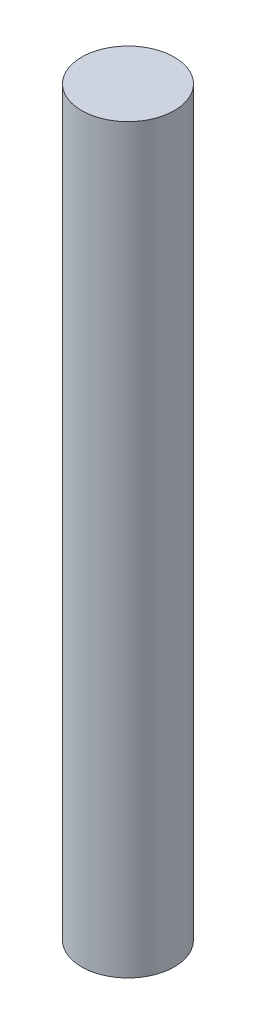
ISO-10303-21;
HEADER;
FILE_DESCRIPTION(('STEP AP214'),'2;1');
FILE_NAME('part.step','',(''),(''),'','','');
FILE_SCHEMA(('AUTOMOTIVE_DESIGN { 1 0 10303 214 1 1 1 1 }'));
ENDSEC;
DATA;
#1=APPLICATION_CONTEXT('core data for automotive mechanical design processes');
#2=APPLICATION_PROTOCOL_DEFINITION('international standard','automotive_design',2000,#1);
#3=PRODUCT_CONTEXT('',#1,'mechanical');
#4=PRODUCT('Part','Part','',(#3));
#5=PRODUCT_RELATED_PRODUCT_CATEGORY('part','',(#4));
#6=PRODUCT_DEFINITION_FORMATION('','',#4);
#7=PRODUCT_DEFINITION_CONTEXT('part definition',#1,'design');
#8=PRODUCT_DEFINITION('design','',#6,#7);
#9=PRODUCT_DEFINITION_SHAPE('','',#8);
#10=(LENGTH_UNIT() NAMED_UNIT(*) SI_UNIT(.MILLI.,.METRE.));
#11=(NAMED_UNIT(*) PLANE_ANGLE_UNIT() SI_UNIT($,.RADIAN.));
#12=(NAMED_UNIT(*) SI_UNIT($,.STERADIAN.) SOLID_ANGLE_UNIT());
#13=UNCERTAINTY_MEASURE_WITH_UNIT(LENGTH_MEASURE(1.E-05),#10,'distance_accuracy_value','');
#14=(GEOMETRIC_REPRESENTATION_CONTEXT(3) GLOBAL_UNCERTAINTY_ASSIGNED_CONTEXT((#13)) GLOBAL_UNIT_ASSIGNED_CONTEXT((#10,
#11,#12)) REPRESENTATION_CONTEXT('',''));
#15=CARTESIAN_POINT('',(0.,0.,0.));
#16=DIRECTION('',(0.,0.,1.));
#17=DIRECTION('',(1.,0.,0.));
#18=AXIS2_PLACEMENT_3D('',#15,#16,#17);
#19=CARTESIAN_POINT('',(0.,40.,0.));
#20=DIRECTION('',(0.,-1.,0.));
#21=DIRECTION('',(0.,0.,-1.));
#22=AXIS2_PLACEMENT_3D('',#19,#20,#21);
#23=CYLINDRICAL_SURFACE('',#22,2.5);
#24=CARTESIAN_POINT('',(0.,40.,0.));
#25=DIRECTION('',(0.,1.,0.));
#26=DIRECTION('',(0.,0.,1.));
#27=AXIS2_PLACEMENT_3D('',#24,#25,#26);
#28=CIRCLE('',#27,2.5);
#29=CARTESIAN_POINT('',(0.,40.,2.5));
#30=VERTEX_POINT('',#29);
#31=EDGE_CURVE('E10',#30,#30,#28,.T.);
#32=ORIENTED_EDGE('',*,*,#31,.F.);
#33=EDGE_LOOP('',(#32));
#34=FACE_BOUND('',#33,.T.);
#35=CARTESIAN_POINT('',(0.,0.,0.));
#36=DIRECTION('',(0.,1.,0.));
#37=DIRECTION('',(0.,0.,1.));
#38=AXIS2_PLACEMENT_3D('',#35,#36,#37);
#39=CIRCLE('',#38,2.5);
#40=CARTESIAN_POINT('',(0.,0.,2.5));
#41=VERTEX_POINT('',#40);
#42=EDGE_CURVE('E34',#41,#41,#39,.T.);
#43=ORIENTED_EDGE('',*,*,#42,.T.);
#44=EDGE_LOOP('',(#43));
#45=FACE_BOUND('',#44,.T.);
#46=ADVANCED_FACE('F31',(#34,#45),#23,.T.);
#47=CARTESIAN_POINT('',(0.,40.,0.));
#48=DIRECTION('',(0.,1.,0.));
#49=DIRECTION('',(0.,0.,1.));
#50=AXIS2_PLACEMENT_3D('',#47,#48,#49);
#51=PLANE('',#50);
#52=ORIENTED_EDGE('',*,*,#31,.T.);
#53=EDGE_LOOP('',(#52));
#54=FACE_BOUND('',#53,.T.);
#55=ADVANCED_FACE('F46',(#54),#51,.T.);
#56=CARTESIAN_POINT('',(0.,0.,0.));
#57=DIRECTION('',(0.,1.,0.));
#58=DIRECTION('',(0.,0.,1.));
#59=AXIS2_PLACEMENT_3D('',#56,#57,#58);
#60=PLANE('',#59);
#61=ORIENTED_EDGE('',*,*,#42,.F.);
#62=EDGE_LOOP('',(#61));
#63=FACE_BOUND('',#62,.T.);
#64=ADVANCED_FACE('F44',(#63),#60,.F.);
#65=CLOSED_SHELL('',(#46,#55,#64));
#66=MANIFOLD_SOLID_BREP('B2',#65);
#67=ADVANCED_BREP_SHAPE_REPRESENTATION('',(#18,#66),#14);
#68=SHAPE_DEFINITION_REPRESENTATION(#9,#67);
ENDSEC;
END-ISO-10303-21;
